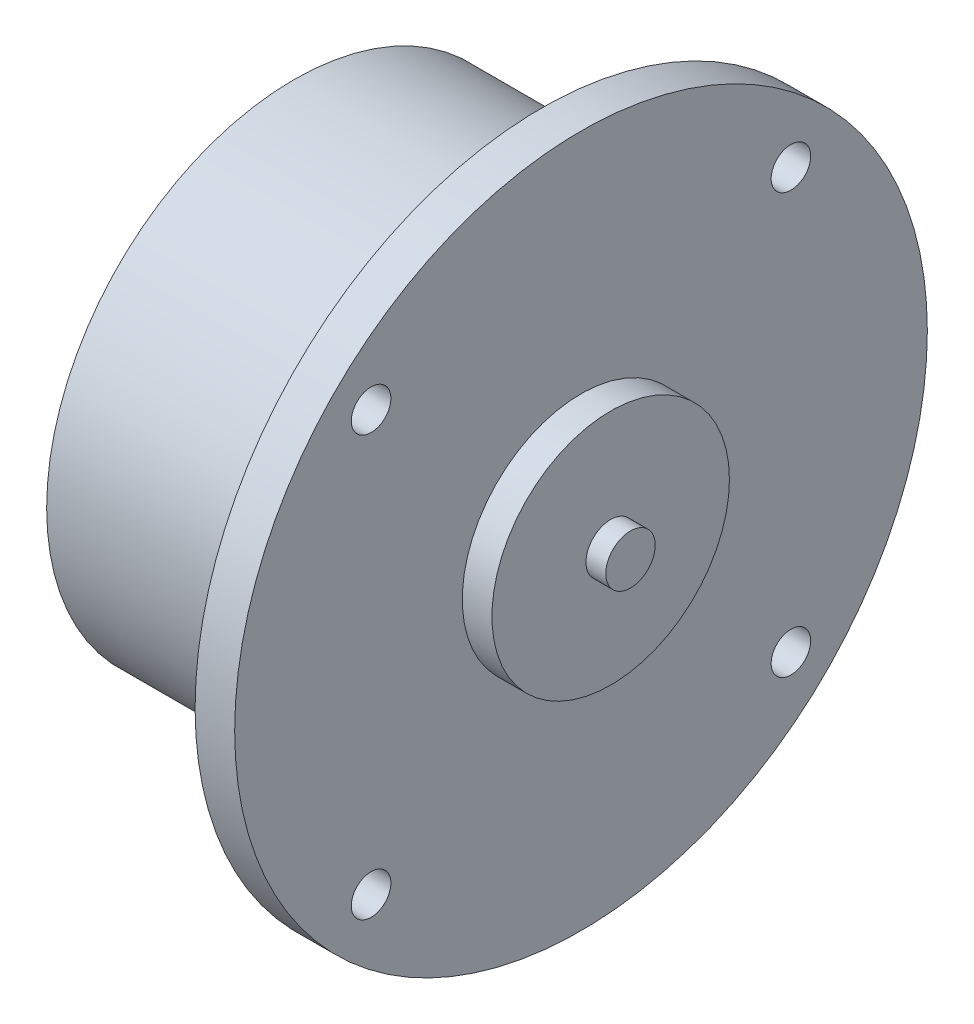
ISO-10303-21;
HEADER;
FILE_DESCRIPTION(('STEP AP214'),'2;1');
FILE_NAME('part.step','',(''),(''),'','','');
FILE_SCHEMA(('AUTOMOTIVE_DESIGN { 1 0 10303 214 1 1 1 1 }'));
ENDSEC;
DATA;
#1=APPLICATION_CONTEXT('core data for automotive mechanical design processes');
#2=APPLICATION_PROTOCOL_DEFINITION('international standard','automotive_design',2000,#1);
#3=PRODUCT_CONTEXT('',#1,'mechanical');
#4=PRODUCT('Part','Part','',(#3));
#5=PRODUCT_RELATED_PRODUCT_CATEGORY('part','',(#4));
#6=PRODUCT_DEFINITION_FORMATION('','',#4);
#7=PRODUCT_DEFINITION_CONTEXT('part definition',#1,'design');
#8=PRODUCT_DEFINITION('design','',#6,#7);
#9=PRODUCT_DEFINITION_SHAPE('','',#8);
#10=(LENGTH_UNIT() NAMED_UNIT(*) SI_UNIT(.MILLI.,.METRE.));
#11=(NAMED_UNIT(*) PLANE_ANGLE_UNIT() SI_UNIT($,.RADIAN.));
#12=(NAMED_UNIT(*) SI_UNIT($,.STERADIAN.) SOLID_ANGLE_UNIT());
#13=UNCERTAINTY_MEASURE_WITH_UNIT(LENGTH_MEASURE(1.E-05),#10,'distance_accuracy_value','');
#14=(GEOMETRIC_REPRESENTATION_CONTEXT(3) GLOBAL_UNCERTAINTY_ASSIGNED_CONTEXT((#13)) GLOBAL_UNIT_ASSIGNED_CONTEXT((#10,
#11,#12)) REPRESENTATION_CONTEXT('',''));
#15=CARTESIAN_POINT('',(0.,0.,0.));
#16=DIRECTION('',(0.,0.,1.));
#17=DIRECTION('',(1.,0.,0.));
#18=AXIS2_PLACEMENT_3D('',#15,#16,#17);
#19=CARTESIAN_POINT('',(4.,0.,0.));
#20=DIRECTION('',(1.,0.,0.));
#21=DIRECTION('',(0.,0.,-1.));
#22=AXIS2_PLACEMENT_3D('',#19,#20,#21);
#23=PLANE('',#22);
#24=CARTESIAN_POINT('',(4.,0.,0.));
#25=DIRECTION('',(1.,0.,0.));
#26=DIRECTION('',(0.,0.,-1.));
#27=AXIS2_PLACEMENT_3D('',#24,#25,#26);
#28=CIRCLE('',#27,12.);
#29=CARTESIAN_POINT('',(4.,0.,-12.));
#30=VERTEX_POINT('',#29);
#31=EDGE_CURVE('E98',#30,#30,#28,.T.);
#32=ORIENTED_EDGE('',*,*,#31,.F.);
#33=EDGE_LOOP('',(#32));
#34=FACE_BOUND('',#33,.T.);
#35=CARTESIAN_POINT('',(4.,-21.2132034355965,21.2132034355964));
#36=DIRECTION('',(1.,0.,0.));
#37=DIRECTION('',(0.,0.,-1.));
#38=AXIS2_PLACEMENT_3D('',#35,#36,#37);
#39=CIRCLE('',#38,2.);
#40=CARTESIAN_POINT('',(4.,-21.2132034355965,19.2132034355964));
#41=VERTEX_POINT('',#40);
#42=EDGE_CURVE('E119',#41,#41,#39,.T.);
#43=ORIENTED_EDGE('',*,*,#42,.F.);
#44=EDGE_LOOP('',(#43));
#45=FACE_BOUND('',#44,.T.);
#46=CARTESIAN_POINT('',(4.,21.2132034355965,-21.2132034355964));
#47=DIRECTION('',(1.,0.,0.));
#48=DIRECTION('',(0.,0.,-1.));
#49=AXIS2_PLACEMENT_3D('',#46,#47,#48);
#50=CIRCLE('',#49,2.);
#51=CARTESIAN_POINT('',(4.,21.2132034355965,-23.2132034355964));
#52=VERTEX_POINT('',#51);
#53=EDGE_CURVE('E135',#52,#52,#50,.T.);
#54=ORIENTED_EDGE('',*,*,#53,.F.);
#55=EDGE_LOOP('',(#54));
#56=FACE_BOUND('',#55,.T.);
#57=CARTESIAN_POINT('',(4.,0.,0.));
#58=DIRECTION('',(1.,0.,0.));
#59=DIRECTION('',(0.,0.,-1.));
#60=AXIS2_PLACEMENT_3D('',#57,#58,#59);
#61=CIRCLE('',#60,35.);
#62=CARTESIAN_POINT('',(4.,0.,-35.));
#63=VERTEX_POINT('',#62);
#64=EDGE_CURVE('E102',#63,#63,#61,.T.);
#65=ORIENTED_EDGE('',*,*,#64,.T.);
#66=EDGE_LOOP('',(#65));
#67=FACE_BOUND('',#66,.T.);
#68=CARTESIAN_POINT('',(4.,21.2132034355965,21.2132034355964));
#69=DIRECTION('',(1.,0.,0.));
#70=DIRECTION('',(0.,0.,-1.));
#71=AXIS2_PLACEMENT_3D('',#68,#69,#70);
#72=CIRCLE('',#71,2.);
#73=CARTESIAN_POINT('',(4.,21.2132034355965,19.2132034355964));
#74=VERTEX_POINT('',#73);
#75=EDGE_CURVE('E127',#74,#74,#72,.T.);
#76=ORIENTED_EDGE('',*,*,#75,.F.);
#77=EDGE_LOOP('',(#76));
#78=FACE_BOUND('',#77,.T.);
#79=CARTESIAN_POINT('',(4.,-21.2132034355965,-21.2132034355964));
#80=DIRECTION('',(1.,0.,0.));
#81=DIRECTION('',(0.,0.,-1.));
#82=AXIS2_PLACEMENT_3D('',#79,#80,#81);
#83=CIRCLE('',#82,2.);
#84=CARTESIAN_POINT('',(4.,-21.2132034355965,-23.2132034355964));
#85=VERTEX_POINT('',#84);
#86=EDGE_CURVE('E111',#85,#85,#83,.T.);
#87=ORIENTED_EDGE('',*,*,#86,.F.);
#88=EDGE_LOOP('',(#87));
#89=FACE_BOUND('',#88,.T.);
#90=ADVANCED_FACE('F39',(#34,#45,#56,#67,#78,#89),#23,.T.);
#91=CARTESIAN_POINT('',(0.,0.,0.));
#92=DIRECTION('',(1.,0.,0.));
#93=DIRECTION('',(0.,0.,-1.));
#94=AXIS2_PLACEMENT_3D('',#91,#92,#93);
#95=PLANE('',#94);
#96=CARTESIAN_POINT('',(0.,0.,0.));
#97=DIRECTION('',(-1.,0.,0.));
#98=DIRECTION('',(0.,0.,1.));
#99=AXIS2_PLACEMENT_3D('',#96,#97,#98);
#100=CIRCLE('',#99,25.);
#101=CARTESIAN_POINT('',(0.,0.,25.));
#102=VERTEX_POINT('',#101);
#103=EDGE_CURVE('E11',#102,#102,#100,.T.);
#104=ORIENTED_EDGE('',*,*,#103,.F.);
#105=EDGE_LOOP('',(#104));
#106=FACE_BOUND('',#105,.T.);
#107=CARTESIAN_POINT('',(0.,0.,0.));
#108=DIRECTION('',(1.,0.,0.));
#109=DIRECTION('',(0.,0.,-1.));
#110=AXIS2_PLACEMENT_3D('',#107,#108,#109);
#111=CIRCLE('',#110,35.);
#112=CARTESIAN_POINT('',(0.,0.,-35.));
#113=VERTEX_POINT('',#112);
#114=EDGE_CURVE('E43',#113,#113,#111,.T.);
#115=ORIENTED_EDGE('',*,*,#114,.F.);
#116=EDGE_LOOP('',(#115));
#117=FACE_BOUND('',#116,.T.);
#118=CARTESIAN_POINT('',(0.,21.2132034355965,-21.2132034355964));
#119=DIRECTION('',(1.,0.,0.));
#120=DIRECTION('',(0.,0.,-1.));
#121=AXIS2_PLACEMENT_3D('',#118,#119,#120);
#122=CIRCLE('',#121,2.);
#123=CARTESIAN_POINT('',(0.,21.2132034355965,-23.2132034355964));
#124=VERTEX_POINT('',#123);
#125=EDGE_CURVE('E131',#124,#124,#122,.T.);
#126=ORIENTED_EDGE('',*,*,#125,.T.);
#127=EDGE_LOOP('',(#126));
#128=FACE_BOUND('',#127,.T.);
#129=CARTESIAN_POINT('',(0.,21.2132034355965,21.2132034355964));
#130=DIRECTION('',(1.,0.,0.));
#131=DIRECTION('',(0.,0.,-1.));
#132=AXIS2_PLACEMENT_3D('',#129,#130,#131);
#133=CIRCLE('',#132,2.);
#134=CARTESIAN_POINT('',(0.,21.2132034355965,19.2132034355964));
#135=VERTEX_POINT('',#134);
#136=EDGE_CURVE('E123',#135,#135,#133,.T.);
#137=ORIENTED_EDGE('',*,*,#136,.T.);
#138=EDGE_LOOP('',(#137));
#139=FACE_BOUND('',#138,.T.);
#140=CARTESIAN_POINT('',(0.,-21.2132034355965,21.2132034355964));
#141=DIRECTION('',(1.,0.,0.));
#142=DIRECTION('',(0.,0.,-1.));
#143=AXIS2_PLACEMENT_3D('',#140,#141,#142);
#144=CIRCLE('',#143,2.);
#145=CARTESIAN_POINT('',(0.,-21.2132034355965,19.2132034355964));
#146=VERTEX_POINT('',#145);
#147=EDGE_CURVE('E115',#146,#146,#144,.T.);
#148=ORIENTED_EDGE('',*,*,#147,.T.);
#149=EDGE_LOOP('',(#148));
#150=FACE_BOUND('',#149,.T.);
#151=CARTESIAN_POINT('',(0.,-21.2132034355965,-21.2132034355964));
#152=DIRECTION('',(1.,0.,0.));
#153=DIRECTION('',(0.,0.,-1.));
#154=AXIS2_PLACEMENT_3D('',#151,#152,#153);
#155=CIRCLE('',#154,2.);
#156=CARTESIAN_POINT('',(0.,-21.2132034355965,-23.2132034355964));
#157=VERTEX_POINT('',#156);
#158=EDGE_CURVE('E107',#157,#157,#155,.T.);
#159=ORIENTED_EDGE('',*,*,#158,.T.);
#160=EDGE_LOOP('',(#159));
#161=FACE_BOUND('',#160,.T.);
#162=ADVANCED_FACE('F150',(#106,#117,#128,#139,#150,#161),#95,.F.);
#163=CARTESIAN_POINT('',(4.,0.,0.));
#164=DIRECTION('',(-1.,0.,0.));
#165=DIRECTION('',(0.,0.,1.));
#166=AXIS2_PLACEMENT_3D('',#163,#164,#165);
#167=CYLINDRICAL_SURFACE('',#166,35.);
#168=ORIENTED_EDGE('',*,*,#64,.F.);
#169=EDGE_LOOP('',(#168));
#170=FACE_BOUND('',#169,.T.);
#171=ORIENTED_EDGE('',*,*,#114,.T.);
#172=EDGE_LOOP('',(#171));
#173=FACE_BOUND('',#172,.T.);
#174=ADVANCED_FACE('F41',(#170,#173),#167,.T.);
#175=CARTESIAN_POINT('',(4.,21.2132034355965,-21.2132034355964));
#176=DIRECTION('',(-1.,0.,0.));
#177=DIRECTION('',(0.,0.,1.));
#178=AXIS2_PLACEMENT_3D('',#175,#176,#177);
#179=CYLINDRICAL_SURFACE('',#178,2.);
#180=ORIENTED_EDGE('',*,*,#53,.T.);
#181=EDGE_LOOP('',(#180));
#182=FACE_BOUND('',#181,.T.);
#183=ORIENTED_EDGE('',*,*,#125,.F.);
#184=EDGE_LOOP('',(#183));
#185=FACE_BOUND('',#184,.T.);
#186=ADVANCED_FACE('F187',(#182,#185),#179,.F.);
#187=CARTESIAN_POINT('',(4.,21.2132034355965,21.2132034355964));
#188=DIRECTION('',(-1.,0.,0.));
#189=DIRECTION('',(0.,0.,1.));
#190=AXIS2_PLACEMENT_3D('',#187,#188,#189);
#191=CYLINDRICAL_SURFACE('',#190,2.);
#192=ORIENTED_EDGE('',*,*,#75,.T.);
#193=EDGE_LOOP('',(#192));
#194=FACE_BOUND('',#193,.T.);
#195=ORIENTED_EDGE('',*,*,#136,.F.);
#196=EDGE_LOOP('',(#195));
#197=FACE_BOUND('',#196,.T.);
#198=ADVANCED_FACE('F175',(#194,#197),#191,.F.);
#199=CARTESIAN_POINT('',(4.,-21.2132034355965,21.2132034355964));
#200=DIRECTION('',(-1.,0.,0.));
#201=DIRECTION('',(0.,0.,1.));
#202=AXIS2_PLACEMENT_3D('',#199,#200,#201);
#203=CYLINDRICAL_SURFACE('',#202,2.);
#204=ORIENTED_EDGE('',*,*,#42,.T.);
#205=EDGE_LOOP('',(#204));
#206=FACE_BOUND('',#205,.T.);
#207=ORIENTED_EDGE('',*,*,#147,.F.);
#208=EDGE_LOOP('',(#207));
#209=FACE_BOUND('',#208,.T.);
#210=ADVANCED_FACE('F165',(#206,#209),#203,.F.);
#211=CARTESIAN_POINT('',(4.,-21.2132034355965,-21.2132034355964));
#212=DIRECTION('',(-1.,0.,0.));
#213=DIRECTION('',(0.,0.,1.));
#214=AXIS2_PLACEMENT_3D('',#211,#212,#213);
#215=CYLINDRICAL_SURFACE('',#214,2.);
#216=ORIENTED_EDGE('',*,*,#86,.T.);
#217=EDGE_LOOP('',(#216));
#218=FACE_BOUND('',#217,.T.);
#219=ORIENTED_EDGE('',*,*,#158,.F.);
#220=EDGE_LOOP('',(#219));
#221=FACE_BOUND('',#220,.T.);
#222=ADVANCED_FACE('F162',(#218,#221),#215,.F.);
#223=CARTESIAN_POINT('',(7.,0.,0.));
#224=DIRECTION('',(-1.,0.,0.));
#225=DIRECTION('',(0.,0.,1.));
#226=AXIS2_PLACEMENT_3D('',#223,#224,#225);
#227=CYLINDRICAL_SURFACE('',#226,12.);
#228=CARTESIAN_POINT('',(7.,0.,0.));
#229=DIRECTION('',(1.,0.,0.));
#230=DIRECTION('',(0.,0.,-1.));
#231=AXIS2_PLACEMENT_3D('',#228,#229,#230);
#232=CIRCLE('',#231,12.);
#233=CARTESIAN_POINT('',(7.,0.,-12.));
#234=VERTEX_POINT('',#233);
#235=EDGE_CURVE('E103',#234,#234,#232,.T.);
#236=ORIENTED_EDGE('',*,*,#235,.F.);
#237=EDGE_LOOP('',(#236));
#238=FACE_BOUND('',#237,.T.);
#239=ORIENTED_EDGE('',*,*,#31,.T.);
#240=EDGE_LOOP('',(#239));
#241=FACE_BOUND('',#240,.T.);
#242=ADVANCED_FACE('F164',(#238,#241),#227,.T.);
#243=CARTESIAN_POINT('',(7.,0.,0.));
#244=DIRECTION('',(1.,0.,0.));
#245=DIRECTION('',(0.,0.,-1.));
#246=AXIS2_PLACEMENT_3D('',#243,#244,#245);
#247=PLANE('',#246);
#248=CARTESIAN_POINT('',(7.,0.,0.));
#249=DIRECTION('',(1.,0.,0.));
#250=DIRECTION('',(0.,0.,-1.));
#251=AXIS2_PLACEMENT_3D('',#248,#249,#250);
#252=CIRCLE('',#251,2.5);
#253=CARTESIAN_POINT('',(7.,0.,-2.5));
#254=VERTEX_POINT('',#253);
#255=EDGE_CURVE('E49',#254,#254,#252,.T.);
#256=ORIENTED_EDGE('',*,*,#255,.F.);
#257=EDGE_LOOP('',(#256));
#258=FACE_BOUND('',#257,.T.);
#259=ORIENTED_EDGE('',*,*,#235,.T.);
#260=EDGE_LOOP('',(#259));
#261=FACE_BOUND('',#260,.T.);
#262=ADVANCED_FACE('F172',(#258,#261),#247,.T.);
#263=CARTESIAN_POINT('',(9.,0.,0.));
#264=DIRECTION('',(-1.,0.,0.));
#265=DIRECTION('',(0.,0.,1.));
#266=AXIS2_PLACEMENT_3D('',#263,#264,#265);
#267=CYLINDRICAL_SURFACE('',#266,2.5);
#268=CARTESIAN_POINT('',(9.,0.,0.));
#269=DIRECTION('',(1.,0.,0.));
#270=DIRECTION('',(0.,0.,-1.));
#271=AXIS2_PLACEMENT_3D('',#268,#269,#270);
#272=CIRCLE('',#271,2.5);
#273=CARTESIAN_POINT('',(9.,0.,-2.5));
#274=VERTEX_POINT('',#273);
#275=EDGE_CURVE('E90',#274,#274,#272,.T.);
#276=ORIENTED_EDGE('',*,*,#275,.F.);
#277=EDGE_LOOP('',(#276));
#278=FACE_BOUND('',#277,.T.);
#279=ORIENTED_EDGE('',*,*,#255,.T.);
#280=EDGE_LOOP('',(#279));
#281=FACE_BOUND('',#280,.T.);
#282=ADVANCED_FACE('F231',(#278,#281),#267,.T.);
#283=CARTESIAN_POINT('',(9.,0.,0.));
#284=DIRECTION('',(1.,0.,0.));
#285=DIRECTION('',(0.,0.,-1.));
#286=AXIS2_PLACEMENT_3D('',#283,#284,#285);
#287=PLANE('',#286);
#288=ORIENTED_EDGE('',*,*,#275,.T.);
#289=EDGE_LOOP('',(#288));
#290=FACE_BOUND('',#289,.T.);
#291=ADVANCED_FACE('F241',(#290),#287,.T.);
#292=CARTESIAN_POINT('',(-25.,0.,0.));
#293=DIRECTION('',(1.,0.,0.));
#294=DIRECTION('',(0.,0.,-1.));
#295=AXIS2_PLACEMENT_3D('',#292,#293,#294);
#296=CYLINDRICAL_SURFACE('',#295,25.);
#297=CARTESIAN_POINT('',(-25.,0.,0.));
#298=DIRECTION('',(-1.,0.,0.));
#299=DIRECTION('',(0.,0.,1.));
#300=AXIS2_PLACEMENT_3D('',#297,#298,#299);
#301=CIRCLE('',#300,25.);
#302=CARTESIAN_POINT('',(-25.,0.,25.));
#303=VERTEX_POINT('',#302);
#304=EDGE_CURVE('E85',#303,#303,#301,.T.);
#305=ORIENTED_EDGE('',*,*,#304,.F.);
#306=EDGE_LOOP('',(#305));
#307=FACE_BOUND('',#306,.T.);
#308=ORIENTED_EDGE('',*,*,#103,.T.);
#309=EDGE_LOOP('',(#308));
#310=FACE_BOUND('',#309,.T.);
#311=ADVANCED_FACE('F250',(#307,#310),#296,.T.);
#312=CARTESIAN_POINT('',(-25.,0.,0.));
#313=DIRECTION('',(-1.,0.,0.));
#314=DIRECTION('',(0.,0.,1.));
#315=AXIS2_PLACEMENT_3D('',#312,#313,#314);
#316=PLANE('',#315);
#317=CARTESIAN_POINT('',(-25.,0.,0.));
#318=DIRECTION('',(-1.,0.,0.));
#319=DIRECTION('',(0.,0.,1.));
#320=AXIS2_PLACEMENT_3D('',#317,#318,#319);
#321=CIRCLE('',#320,2.5);
#322=CARTESIAN_POINT('',(-25.,-2.,1.5));
#323=VERTEX_POINT('',#322);
#324=CARTESIAN_POINT('',(-25.,-2.,-1.5));
#325=VERTEX_POINT('',#324);
#326=EDGE_CURVE('E80',#323,#325,#321,.T.);
#327=ORIENTED_EDGE('',*,*,#326,.F.);
#328=DIRECTION('',(0.,0.,-1.));
#329=VECTOR('',#328,1.);
#330=CARTESIAN_POINT('',(-25.,-2.,1.5));
#331=LINE('',#330,#329);
#332=EDGE_CURVE('E73',#323,#325,#331,.T.);
#333=ORIENTED_EDGE('',*,*,#332,.T.);
#334=EDGE_LOOP('',(#327,#333));
#335=FACE_BOUND('',#334,.T.);
#336=ORIENTED_EDGE('',*,*,#304,.T.);
#337=EDGE_LOOP('',(#336));
#338=FACE_BOUND('',#337,.T.);
#339=ADVANCED_FACE('F263',(#335,#338),#316,.T.);
#340=CARTESIAN_POINT('',(-36.,0.,0.));
#341=DIRECTION('',(1.,0.,0.));
#342=DIRECTION('',(0.,0.,-1.));
#343=AXIS2_PLACEMENT_3D('',#340,#341,#342);
#344=CYLINDRICAL_SURFACE('',#343,2.5);
#345=CARTESIAN_POINT('',(-36.,0.,0.));
#346=DIRECTION('',(-1.,0.,0.));
#347=DIRECTION('',(0.,0.,1.));
#348=AXIS2_PLACEMENT_3D('',#345,#346,#347);
#349=CIRCLE('',#348,2.5);
#350=CARTESIAN_POINT('',(-36.,-2.,1.5));
#351=VERTEX_POINT('',#350);
#352=CARTESIAN_POINT('',(-36.,-2.,-1.5));
#353=VERTEX_POINT('',#352);
#354=EDGE_CURVE('E78',#351,#353,#349,.T.);
#355=ORIENTED_EDGE('',*,*,#354,.F.);
#356=DIRECTION('',(-1.,0.,0.));
#357=VECTOR('',#356,1.);
#358=CARTESIAN_POINT('',(-25.,-2.,1.5));
#359=LINE('',#358,#357);
#360=EDGE_CURVE('E57',#323,#351,#359,.T.);
#361=ORIENTED_EDGE('',*,*,#360,.F.);
#362=ORIENTED_EDGE('',*,*,#326,.T.);
#363=DIRECTION('',(-1.,0.,0.));
#364=VECTOR('',#363,1.);
#365=CARTESIAN_POINT('',(-25.,-2.,-1.5));
#366=LINE('',#365,#364);
#367=EDGE_CURVE('E63',#325,#353,#366,.T.);
#368=ORIENTED_EDGE('',*,*,#367,.T.);
#369=EDGE_LOOP('',(#355,#361,#362,#368));
#370=FACE_BOUND('',#369,.T.);
#371=ADVANCED_FACE('F77',(#370),#344,.T.);
#372=CARTESIAN_POINT('',(-36.,0.,0.));
#373=DIRECTION('',(-1.,0.,0.));
#374=DIRECTION('',(0.,0.,1.));
#375=AXIS2_PLACEMENT_3D('',#372,#373,#374);
#376=PLANE('',#375);
#377=DIRECTION('',(0.,0.,-1.));
#378=VECTOR('',#377,1.);
#379=CARTESIAN_POINT('',(-36.,-2.,1.5));
#380=LINE('',#379,#378);
#381=EDGE_CURVE('E67',#351,#353,#380,.T.);
#382=ORIENTED_EDGE('',*,*,#381,.F.);
#383=ORIENTED_EDGE('',*,*,#354,.T.);
#384=EDGE_LOOP('',(#382,#383));
#385=FACE_BOUND('',#384,.T.);
#386=ADVANCED_FACE('F83',(#385),#376,.T.);
#387=CARTESIAN_POINT('',(-25.,-2.,1.5));
#388=DIRECTION('',(0.,1.,0.));
#389=DIRECTION('',(0.,0.,1.));
#390=AXIS2_PLACEMENT_3D('',#387,#388,#389);
#391=PLANE('',#390);
#392=ORIENTED_EDGE('',*,*,#381,.T.);
#393=ORIENTED_EDGE('',*,*,#367,.F.);
#394=ORIENTED_EDGE('',*,*,#332,.F.);
#395=ORIENTED_EDGE('',*,*,#360,.T.);
#396=EDGE_LOOP('',(#392,#393,#394,#395));
#397=FACE_BOUND('',#396,.T.);
#398=ADVANCED_FACE('F68',(#397),#391,.F.);
#399=CLOSED_SHELL('',(#90,#162,#174,#186,#198,#210,#222,#242,#262,#282,#291,#311,#339,#371,#386,#398));
#400=MANIFOLD_SOLID_BREP('B2',#399);
#401=ADVANCED_BREP_SHAPE_REPRESENTATION('',(#18,#400),#14);
#402=SHAPE_DEFINITION_REPRESENTATION(#9,#401);
ENDSEC;
END-ISO-10303-21;
